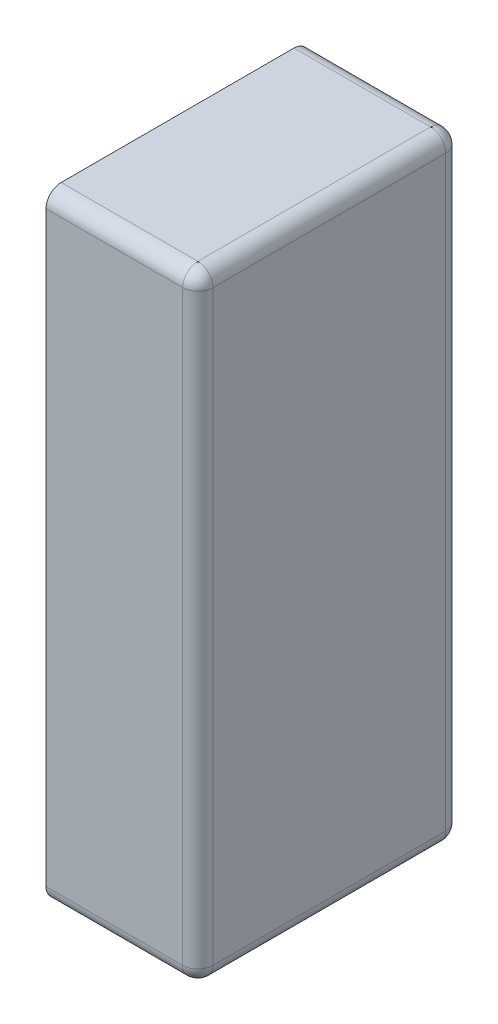
ISO-10303-21;
HEADER;
FILE_DESCRIPTION(('STEP AP214'),'2;1');
FILE_NAME('part.step','',(''),(''),'','','');
FILE_SCHEMA(('AUTOMOTIVE_DESIGN { 1 0 10303 214 1 1 1 1 }'));
ENDSEC;
DATA;
#1=APPLICATION_CONTEXT('core data for automotive mechanical design processes');
#2=APPLICATION_PROTOCOL_DEFINITION('international standard','automotive_design',2000,#1);
#3=PRODUCT_CONTEXT('',#1,'mechanical');
#4=PRODUCT('Part','Part','',(#3));
#5=PRODUCT_RELATED_PRODUCT_CATEGORY('part','',(#4));
#6=PRODUCT_DEFINITION_FORMATION('','',#4);
#7=PRODUCT_DEFINITION_CONTEXT('part definition',#1,'design');
#8=PRODUCT_DEFINITION('design','',#6,#7);
#9=PRODUCT_DEFINITION_SHAPE('','',#8);
#10=(LENGTH_UNIT() NAMED_UNIT(*) SI_UNIT(.MILLI.,.METRE.));
#11=(NAMED_UNIT(*) PLANE_ANGLE_UNIT() SI_UNIT($,.RADIAN.));
#12=(NAMED_UNIT(*) SI_UNIT($,.STERADIAN.) SOLID_ANGLE_UNIT());
#13=UNCERTAINTY_MEASURE_WITH_UNIT(LENGTH_MEASURE(1.E-05),#10,'distance_accuracy_value','');
#14=(GEOMETRIC_REPRESENTATION_CONTEXT(3) GLOBAL_UNCERTAINTY_ASSIGNED_CONTEXT((#13)) GLOBAL_UNIT_ASSIGNED_CONTEXT((#10,
#11,#12)) REPRESENTATION_CONTEXT('',''));
#15=CARTESIAN_POINT('',(0.,0.,0.));
#16=DIRECTION('',(0.,0.,1.));
#17=DIRECTION('',(1.,0.,0.));
#18=AXIS2_PLACEMENT_3D('',#15,#16,#17);
#19=CARTESIAN_POINT('',(1.,0.58,0.02));
#20=DIRECTION('',(-1.,0.,0.));
#21=DIRECTION('',(0.,-1.,0.));
#22=AXIS2_PLACEMENT_3D('',#19,#20,#21);
#23=CYLINDRICAL_SURFACE('',#22,0.03);
#24=DIRECTION('',(1.,0.,0.));
#25=VECTOR('',#24,1.);
#26=CARTESIAN_POINT('',(0.7,0.61,0.02));
#27=LINE('',#26,#25);
#28=CARTESIAN_POINT('',(0.7,0.61,0.02));
#29=VERTEX_POINT('',#28);
#30=CARTESIAN_POINT('',(0.97,0.61,0.02));
#31=VERTEX_POINT('',#30);
#32=EDGE_CURVE('E177',#29,#31,#27,.T.);
#33=ORIENTED_EDGE('',*,*,#32,.T.);
#34=CARTESIAN_POINT('',(0.97,0.58,0.02));
#35=DIRECTION('',(1.,0.,0.));
#36=DIRECTION('',(0.,0.,-1.));
#37=AXIS2_PLACEMENT_3D('',#34,#35,#36);
#38=CIRCLE('',#37,0.03);
#39=CARTESIAN_POINT('',(0.97,0.58,-0.01));
#40=VERTEX_POINT('',#39);
#41=EDGE_CURVE('E120',#40,#31,#38,.T.);
#42=ORIENTED_EDGE('',*,*,#41,.F.);
#43=DIRECTION('',(-1.,0.,0.));
#44=VECTOR('',#43,1.);
#45=CARTESIAN_POINT('',(0.97,0.58,-0.01));
#46=LINE('',#45,#44);
#47=CARTESIAN_POINT('',(0.7,0.58,-0.01));
#48=VERTEX_POINT('',#47);
#49=EDGE_CURVE('E11',#40,#48,#46,.T.);
#50=ORIENTED_EDGE('',*,*,#49,.T.);
#51=CARTESIAN_POINT('',(0.7,0.58,0.02));
#52=DIRECTION('',(-1.,0.,0.));
#53=DIRECTION('',(0.,1.,0.));
#54=AXIS2_PLACEMENT_3D('',#51,#52,#53);
#55=CIRCLE('',#54,0.03);
#56=EDGE_CURVE('E118',#29,#48,#55,.T.);
#57=ORIENTED_EDGE('',*,*,#56,.F.);
#58=EDGE_LOOP('',(#33,#42,#50,#57));
#59=FACE_BOUND('',#58,.T.);
#60=ADVANCED_FACE('F17',(#59),#23,.T.);
#61=CARTESIAN_POINT('',(1.,-0.61,-0.01));
#62=DIRECTION('',(0.,0.,1.));
#63=DIRECTION('',(1.,0.,0.));
#64=AXIS2_PLACEMENT_3D('',#61,#62,#63);
#65=PLANE('',#64);
#66=DIRECTION('',(0.,-1.,0.));
#67=VECTOR('',#66,1.);
#68=CARTESIAN_POINT('',(0.7,0.58,-0.01));
#69=LINE('',#68,#67);
#70=CARTESIAN_POINT('',(0.7,-0.58,-0.01));
#71=VERTEX_POINT('',#70);
#72=EDGE_CURVE('E122',#48,#71,#69,.T.);
#73=ORIENTED_EDGE('',*,*,#72,.F.);
#74=ORIENTED_EDGE('',*,*,#49,.F.);
#75=DIRECTION('',(0.,1.,0.));
#76=VECTOR('',#75,1.);
#77=CARTESIAN_POINT('',(0.97,-0.58,-0.01));
#78=LINE('',#77,#76);
#79=CARTESIAN_POINT('',(0.97,-0.58,-0.01));
#80=VERTEX_POINT('',#79);
#81=EDGE_CURVE('E198',#80,#40,#78,.T.);
#82=ORIENTED_EDGE('',*,*,#81,.F.);
#83=DIRECTION('',(1.,0.,0.));
#84=VECTOR('',#83,1.);
#85=CARTESIAN_POINT('',(0.7,-0.58,-0.01));
#86=LINE('',#85,#84);
#87=EDGE_CURVE('E25',#71,#80,#86,.T.);
#88=ORIENTED_EDGE('',*,*,#87,.F.);
#89=EDGE_LOOP('',(#73,#74,#82,#88));
#90=FACE_BOUND('',#89,.T.);
#91=ADVANCED_FACE('F123',(#90),#65,.F.);
#92=CARTESIAN_POINT('',(1.,-0.58,0.02));
#93=DIRECTION('',(-1.,0.,0.));
#94=DIRECTION('',(0.,-1.,0.));
#95=AXIS2_PLACEMENT_3D('',#92,#93,#94);
#96=CYLINDRICAL_SURFACE('',#95,0.03);
#97=ORIENTED_EDGE('',*,*,#87,.T.);
#98=CARTESIAN_POINT('',(0.97,-0.58,0.02));
#99=DIRECTION('',(1.,0.,0.));
#100=DIRECTION('',(0.,-1.,0.));
#101=AXIS2_PLACEMENT_3D('',#98,#99,#100);
#102=CIRCLE('',#101,0.03);
#103=CARTESIAN_POINT('',(0.97,-0.61,0.02));
#104=VERTEX_POINT('',#103);
#105=EDGE_CURVE('E209',#104,#80,#102,.T.);
#106=ORIENTED_EDGE('',*,*,#105,.F.);
#107=DIRECTION('',(-1.,0.,0.));
#108=VECTOR('',#107,1.);
#109=CARTESIAN_POINT('',(0.97,-0.61,0.02));
#110=LINE('',#109,#108);
#111=CARTESIAN_POINT('',(0.7,-0.61,0.02));
#112=VERTEX_POINT('',#111);
#113=EDGE_CURVE('E50',#104,#112,#110,.T.);
#114=ORIENTED_EDGE('',*,*,#113,.T.);
#115=CARTESIAN_POINT('',(0.7,-0.58,0.02));
#116=DIRECTION('',(-1.,0.,0.));
#117=DIRECTION('',(0.,0.,-1.));
#118=AXIS2_PLACEMENT_3D('',#115,#116,#117);
#119=CIRCLE('',#118,0.03);
#120=EDGE_CURVE('E127',#71,#112,#119,.T.);
#121=ORIENTED_EDGE('',*,*,#120,.F.);
#122=EDGE_LOOP('',(#97,#106,#114,#121));
#123=FACE_BOUND('',#122,.T.);
#124=ADVANCED_FACE('F234',(#123),#96,.T.);
#125=CARTESIAN_POINT('',(1.,-0.61,0.51));
#126=DIRECTION('',(0.,1.,0.));
#127=DIRECTION('',(1.,0.,0.));
#128=AXIS2_PLACEMENT_3D('',#125,#126,#127);
#129=PLANE('',#128);
#130=DIRECTION('',(0.,0.,1.));
#131=VECTOR('',#130,1.);
#132=CARTESIAN_POINT('',(0.7,-0.61,0.02));
#133=LINE('',#132,#131);
#134=CARTESIAN_POINT('',(0.7,-0.61,0.48));
#135=VERTEX_POINT('',#134);
#136=EDGE_CURVE('E150',#112,#135,#133,.T.);
#137=ORIENTED_EDGE('',*,*,#136,.F.);
#138=ORIENTED_EDGE('',*,*,#113,.F.);
#139=DIRECTION('',(0.,0.,-1.));
#140=VECTOR('',#139,1.);
#141=CARTESIAN_POINT('',(0.97,-0.61,0.48));
#142=LINE('',#141,#140);
#143=CARTESIAN_POINT('',(0.97,-0.61,0.48));
#144=VERTEX_POINT('',#143);
#145=EDGE_CURVE('E216',#144,#104,#142,.T.);
#146=ORIENTED_EDGE('',*,*,#145,.F.);
#147=DIRECTION('',(1.,0.,0.));
#148=VECTOR('',#147,1.);
#149=CARTESIAN_POINT('',(0.7,-0.61,0.48));
#150=LINE('',#149,#148);
#151=EDGE_CURVE('E147',#135,#144,#150,.T.);
#152=ORIENTED_EDGE('',*,*,#151,.F.);
#153=EDGE_LOOP('',(#137,#138,#146,#152));
#154=FACE_BOUND('',#153,.T.);
#155=ADVANCED_FACE('F236',(#154),#129,.F.);
#156=CARTESIAN_POINT('',(0.97,0.58,0.48));
#157=DIRECTION('',(0.,1.,0.));
#158=DIRECTION('',(1.,0.,0.));
#159=AXIS2_PLACEMENT_3D('',#156,#157,#158);
#160=SPHERICAL_SURFACE('',#159,0.03);
#161=CARTESIAN_POINT('',(0.97,0.58,0.48));
#162=DIRECTION('',(0.,1.,0.));
#163=DIRECTION('',(0.,0.,1.));
#164=AXIS2_PLACEMENT_3D('',#161,#162,#163);
#165=CIRCLE('',#164,0.03);
#166=CARTESIAN_POINT('',(0.97,0.58,0.51));
#167=VERTEX_POINT('',#166);
#168=CARTESIAN_POINT('',(1.,0.58,0.48));
#169=VERTEX_POINT('',#168);
#170=EDGE_CURVE('E224',#167,#169,#165,.T.);
#171=ORIENTED_EDGE('',*,*,#170,.T.);
#172=CARTESIAN_POINT('',(0.97,0.58,0.48));
#173=DIRECTION('',(0.,0.,1.));
#174=DIRECTION('',(1.,0.,0.));
#175=AXIS2_PLACEMENT_3D('',#172,#173,#174);
#176=CIRCLE('',#175,0.03);
#177=CARTESIAN_POINT('',(0.97,0.61,0.48));
#178=VERTEX_POINT('',#177);
#179=EDGE_CURVE('E166',#169,#178,#176,.T.);
#180=ORIENTED_EDGE('',*,*,#179,.T.);
#181=CARTESIAN_POINT('',(0.97,0.58,0.48));
#182=DIRECTION('',(1.,0.,0.));
#183=DIRECTION('',(0.,1.,0.));
#184=AXIS2_PLACEMENT_3D('',#181,#182,#183);
#185=CIRCLE('',#184,0.03);
#186=EDGE_CURVE('E37',#178,#167,#185,.T.);
#187=ORIENTED_EDGE('',*,*,#186,.T.);
#188=EDGE_LOOP('',(#171,#180,#187));
#189=FACE_BOUND('',#188,.T.);
#190=ADVANCED_FACE('F476',(#189),#160,.T.);
#191=CARTESIAN_POINT('',(1.,0.58,0.48));
#192=DIRECTION('',(-1.,0.,0.));
#193=DIRECTION('',(0.,-1.,0.));
#194=AXIS2_PLACEMENT_3D('',#191,#192,#193);
#195=CYLINDRICAL_SURFACE('',#194,0.03);
#196=DIRECTION('',(1.,0.,0.));
#197=VECTOR('',#196,1.);
#198=CARTESIAN_POINT('',(0.7,0.58,0.51));
#199=LINE('',#198,#197);
#200=CARTESIAN_POINT('',(0.7,0.58,0.51));
#201=VERTEX_POINT('',#200);
#202=EDGE_CURVE('E158',#201,#167,#199,.T.);
#203=ORIENTED_EDGE('',*,*,#202,.T.);
#204=ORIENTED_EDGE('',*,*,#186,.F.);
#205=DIRECTION('',(-1.,0.,0.));
#206=VECTOR('',#205,1.);
#207=CARTESIAN_POINT('',(0.97,0.61,0.48));
#208=LINE('',#207,#206);
#209=CARTESIAN_POINT('',(0.7,0.61,0.48));
#210=VERTEX_POINT('',#209);
#211=EDGE_CURVE('E170',#178,#210,#208,.T.);
#212=ORIENTED_EDGE('',*,*,#211,.T.);
#213=CARTESIAN_POINT('',(0.7,0.58,0.48));
#214=DIRECTION('',(-1.,0.,0.));
#215=DIRECTION('',(0.,0.,1.));
#216=AXIS2_PLACEMENT_3D('',#213,#214,#215);
#217=CIRCLE('',#216,0.03);
#218=EDGE_CURVE('E165',#201,#210,#217,.T.);
#219=ORIENTED_EDGE('',*,*,#218,.F.);
#220=EDGE_LOOP('',(#203,#204,#212,#219));
#221=FACE_BOUND('',#220,.T.);
#222=ADVANCED_FACE('F485',(#221),#195,.T.);
#223=CARTESIAN_POINT('',(1.,0.61,0.51));
#224=DIRECTION('',(0.,0.,-1.));
#225=DIRECTION('',(0.,-1.,0.));
#226=AXIS2_PLACEMENT_3D('',#223,#224,#225);
#227=PLANE('',#226);
#228=DIRECTION('',(0.,-1.,0.));
#229=VECTOR('',#228,1.);
#230=CARTESIAN_POINT('',(0.97,0.58,0.51));
#231=LINE('',#230,#229);
#232=CARTESIAN_POINT('',(0.97,-0.58,0.51));
#233=VERTEX_POINT('',#232);
#234=EDGE_CURVE('E161',#167,#233,#231,.T.);
#235=ORIENTED_EDGE('',*,*,#234,.F.);
#236=ORIENTED_EDGE('',*,*,#202,.F.);
#237=DIRECTION('',(0.,1.,0.));
#238=VECTOR('',#237,1.);
#239=CARTESIAN_POINT('',(0.7,-0.58,0.51));
#240=LINE('',#239,#238);
#241=CARTESIAN_POINT('',(0.7,-0.58,0.51));
#242=VERTEX_POINT('',#241);
#243=EDGE_CURVE('E157',#242,#201,#240,.T.);
#244=ORIENTED_EDGE('',*,*,#243,.F.);
#245=DIRECTION('',(-1.,0.,0.));
#246=VECTOR('',#245,1.);
#247=CARTESIAN_POINT('',(0.97,-0.58,0.51));
#248=LINE('',#247,#246);
#249=EDGE_CURVE('E143',#233,#242,#248,.T.);
#250=ORIENTED_EDGE('',*,*,#249,.F.);
#251=EDGE_LOOP('',(#235,#236,#244,#250));
#252=FACE_BOUND('',#251,.T.);
#253=ADVANCED_FACE('F250',(#252),#227,.F.);
#254=CARTESIAN_POINT('',(0.97,0.,0.48));
#255=DIRECTION('',(0.,1.,0.));
#256=DIRECTION('',(-1.,0.,0.));
#257=AXIS2_PLACEMENT_3D('',#254,#255,#256);
#258=CYLINDRICAL_SURFACE('',#257,0.03);
#259=DIRECTION('',(0.,1.,0.));
#260=VECTOR('',#259,1.);
#261=CARTESIAN_POINT('',(1.,-0.58,0.48));
#262=LINE('',#261,#260);
#263=CARTESIAN_POINT('',(1.,-0.58,0.48));
#264=VERTEX_POINT('',#263);
#265=EDGE_CURVE('E223',#264,#169,#262,.T.);
#266=ORIENTED_EDGE('',*,*,#265,.T.);
#267=ORIENTED_EDGE('',*,*,#170,.F.);
#268=ORIENTED_EDGE('',*,*,#234,.T.);
#269=CARTESIAN_POINT('',(0.97,-0.58,0.48));
#270=DIRECTION('',(0.,-1.,0.));
#271=DIRECTION('',(1.,0.,0.));
#272=AXIS2_PLACEMENT_3D('',#269,#270,#271);
#273=CIRCLE('',#272,0.03);
#274=EDGE_CURVE('E281',#264,#233,#273,.T.);
#275=ORIENTED_EDGE('',*,*,#274,.F.);
#276=EDGE_LOOP('',(#266,#267,#268,#275));
#277=FACE_BOUND('',#276,.T.);
#278=ADVANCED_FACE('F282',(#277),#258,.T.);
#279=CARTESIAN_POINT('',(1.,0.,0.));
#280=DIRECTION('',(1.,0.,0.));
#281=DIRECTION('',(0.,1.,0.));
#282=AXIS2_PLACEMENT_3D('',#279,#280,#281);
#283=PLANE('',#282);
#284=DIRECTION('',(0.,-1.,0.));
#285=VECTOR('',#284,1.);
#286=CARTESIAN_POINT('',(1.,0.58,0.02));
#287=LINE('',#286,#285);
#288=CARTESIAN_POINT('',(1.,0.58,0.02));
#289=VERTEX_POINT('',#288);
#290=CARTESIAN_POINT('',(1.,-0.58,0.02));
#291=VERTEX_POINT('',#290);
#292=EDGE_CURVE('E201',#289,#291,#287,.T.);
#293=ORIENTED_EDGE('',*,*,#292,.F.);
#294=DIRECTION('',(0.,0.,-1.));
#295=VECTOR('',#294,1.);
#296=CARTESIAN_POINT('',(1.,0.58,0.48));
#297=LINE('',#296,#295);
#298=EDGE_CURVE('E169',#169,#289,#297,.T.);
#299=ORIENTED_EDGE('',*,*,#298,.F.);
#300=ORIENTED_EDGE('',*,*,#265,.F.);
#301=DIRECTION('',(0.,0.,1.));
#302=VECTOR('',#301,1.);
#303=CARTESIAN_POINT('',(1.,-0.58,0.02));
#304=LINE('',#303,#302);
#305=EDGE_CURVE('E219',#291,#264,#304,.T.);
#306=ORIENTED_EDGE('',*,*,#305,.F.);
#307=EDGE_LOOP('',(#293,#299,#300,#306));
#308=FACE_BOUND('',#307,.T.);
#309=ADVANCED_FACE('F278',(#308),#283,.T.);
#310=CARTESIAN_POINT('',(0.97,-0.58,0.));
#311=DIRECTION('',(0.,0.,1.));
#312=DIRECTION('',(1.,0.,0.));
#313=AXIS2_PLACEMENT_3D('',#310,#311,#312);
#314=CYLINDRICAL_SURFACE('',#313,0.03);
#315=ORIENTED_EDGE('',*,*,#145,.T.);
#316=CARTESIAN_POINT('',(0.97,-0.58,0.02));
#317=DIRECTION('',(0.,0.,-1.));
#318=DIRECTION('',(1.,0.,0.));
#319=AXIS2_PLACEMENT_3D('',#316,#317,#318);
#320=CIRCLE('',#319,0.03);
#321=EDGE_CURVE('E212',#291,#104,#320,.T.);
#322=ORIENTED_EDGE('',*,*,#321,.F.);
#323=ORIENTED_EDGE('',*,*,#305,.T.);
#324=CARTESIAN_POINT('',(0.97,-0.58,0.48));
#325=DIRECTION('',(0.,0.,1.));
#326=DIRECTION('',(0.,-1.,0.));
#327=AXIS2_PLACEMENT_3D('',#324,#325,#326);
#328=CIRCLE('',#327,0.03);
#329=EDGE_CURVE('E269',#144,#264,#328,.T.);
#330=ORIENTED_EDGE('',*,*,#329,.F.);
#331=EDGE_LOOP('',(#315,#322,#323,#330));
#332=FACE_BOUND('',#331,.T.);
#333=ADVANCED_FACE('F267',(#332),#314,.T.);
#334=CARTESIAN_POINT('',(0.97,-0.58,0.02));
#335=DIRECTION('',(0.,1.,0.));
#336=DIRECTION('',(1.,0.,0.));
#337=AXIS2_PLACEMENT_3D('',#334,#335,#336);
#338=SPHERICAL_SURFACE('',#337,0.03);
#339=ORIENTED_EDGE('',*,*,#105,.T.);
#340=CARTESIAN_POINT('',(0.97,-0.58,0.02));
#341=DIRECTION('',(0.,-1.,0.));
#342=DIRECTION('',(0.,0.,-1.));
#343=AXIS2_PLACEMENT_3D('',#340,#341,#342);
#344=CIRCLE('',#343,0.03);
#345=EDGE_CURVE('E205',#80,#291,#344,.T.);
#346=ORIENTED_EDGE('',*,*,#345,.T.);
#347=ORIENTED_EDGE('',*,*,#321,.T.);
#348=EDGE_LOOP('',(#339,#346,#347));
#349=FACE_BOUND('',#348,.T.);
#350=ADVANCED_FACE('F271',(#349),#338,.T.);
#351=CARTESIAN_POINT('',(0.97,0.,0.02));
#352=DIRECTION('',(0.,-1.,0.));
#353=DIRECTION('',(1.,0.,0.));
#354=AXIS2_PLACEMENT_3D('',#351,#352,#353);
#355=CYLINDRICAL_SURFACE('',#354,0.03);
#356=ORIENTED_EDGE('',*,*,#81,.T.);
#357=CARTESIAN_POINT('',(0.97,0.58,0.02));
#358=DIRECTION('',(0.,1.,0.));
#359=DIRECTION('',(1.,0.,0.));
#360=AXIS2_PLACEMENT_3D('',#357,#358,#359);
#361=CIRCLE('',#360,0.03);
#362=EDGE_CURVE('E192',#289,#40,#361,.T.);
#363=ORIENTED_EDGE('',*,*,#362,.F.);
#364=ORIENTED_EDGE('',*,*,#292,.T.);
#365=ORIENTED_EDGE('',*,*,#345,.F.);
#366=EDGE_LOOP('',(#356,#363,#364,#365));
#367=FACE_BOUND('',#366,.T.);
#368=ADVANCED_FACE('F275',(#367),#355,.T.);
#369=CARTESIAN_POINT('',(0.97,0.58,0.02));
#370=DIRECTION('',(0.,1.,0.));
#371=DIRECTION('',(1.,0.,0.));
#372=AXIS2_PLACEMENT_3D('',#369,#370,#371);
#373=SPHERICAL_SURFACE('',#372,0.03);
#374=ORIENTED_EDGE('',*,*,#41,.T.);
#375=CARTESIAN_POINT('',(0.97,0.58,0.02));
#376=DIRECTION('',(0.,0.,-1.));
#377=DIRECTION('',(0.,1.,0.));
#378=AXIS2_PLACEMENT_3D('',#375,#376,#377);
#379=CIRCLE('',#378,0.03);
#380=EDGE_CURVE('E186',#31,#289,#379,.T.);
#381=ORIENTED_EDGE('',*,*,#380,.T.);
#382=ORIENTED_EDGE('',*,*,#362,.T.);
#383=EDGE_LOOP('',(#374,#381,#382));
#384=FACE_BOUND('',#383,.T.);
#385=ADVANCED_FACE('F466',(#384),#373,.T.);
#386=CARTESIAN_POINT('',(0.97,0.58,0.));
#387=DIRECTION('',(0.,0.,-1.));
#388=DIRECTION('',(-1.,0.,0.));
#389=AXIS2_PLACEMENT_3D('',#386,#387,#388);
#390=CYLINDRICAL_SURFACE('',#389,0.03);
#391=DIRECTION('',(0.,0.,1.));
#392=VECTOR('',#391,1.);
#393=CARTESIAN_POINT('',(0.97,0.61,0.02));
#394=LINE('',#393,#392);
#395=EDGE_CURVE('E173',#31,#178,#394,.T.);
#396=ORIENTED_EDGE('',*,*,#395,.T.);
#397=ORIENTED_EDGE('',*,*,#179,.F.);
#398=ORIENTED_EDGE('',*,*,#298,.T.);
#399=ORIENTED_EDGE('',*,*,#380,.F.);
#400=EDGE_LOOP('',(#396,#397,#398,#399));
#401=FACE_BOUND('',#400,.T.);
#402=ADVANCED_FACE('F440',(#401),#390,.T.);
#403=CARTESIAN_POINT('',(1.,0.61,-0.01));
#404=DIRECTION('',(0.,-1.,0.));
#405=DIRECTION('',(0.,0.,-1.));
#406=AXIS2_PLACEMENT_3D('',#403,#404,#405);
#407=PLANE('',#406);
#408=ORIENTED_EDGE('',*,*,#395,.F.);
#409=ORIENTED_EDGE('',*,*,#32,.F.);
#410=DIRECTION('',(0.,0.,-1.));
#411=VECTOR('',#410,1.);
#412=CARTESIAN_POINT('',(0.7,0.61,0.48));
#413=LINE('',#412,#411);
#414=EDGE_CURVE('E132',#210,#29,#413,.T.);
#415=ORIENTED_EDGE('',*,*,#414,.F.);
#416=ORIENTED_EDGE('',*,*,#211,.F.);
#417=EDGE_LOOP('',(#408,#409,#415,#416));
#418=FACE_BOUND('',#417,.T.);
#419=ADVANCED_FACE('F406',(#418),#407,.F.);
#420=CARTESIAN_POINT('',(0.7,0.,0.));
#421=DIRECTION('',(1.,0.,0.));
#422=DIRECTION('',(0.,1.,0.));
#423=AXIS2_PLACEMENT_3D('',#420,#421,#422);
#424=PLANE('',#423);
#425=ORIENTED_EDGE('',*,*,#414,.T.);
#426=ORIENTED_EDGE('',*,*,#56,.T.);
#427=ORIENTED_EDGE('',*,*,#72,.T.);
#428=ORIENTED_EDGE('',*,*,#120,.T.);
#429=ORIENTED_EDGE('',*,*,#136,.T.);
#430=CARTESIAN_POINT('',(0.7,-0.58,0.48));
#431=DIRECTION('',(-1.,0.,0.));
#432=DIRECTION('',(0.,-1.,0.));
#433=AXIS2_PLACEMENT_3D('',#430,#431,#432);
#434=CIRCLE('',#433,0.03);
#435=EDGE_CURVE('E139',#135,#242,#434,.T.);
#436=ORIENTED_EDGE('',*,*,#435,.T.);
#437=ORIENTED_EDGE('',*,*,#243,.T.);
#438=ORIENTED_EDGE('',*,*,#218,.T.);
#439=EDGE_LOOP('',(#425,#426,#427,#428,#429,#436,#437,#438));
#440=FACE_BOUND('',#439,.T.);
#441=ADVANCED_FACE('F129',(#440),#424,.F.);
#442=CARTESIAN_POINT('',(1.,-0.58,0.48));
#443=DIRECTION('',(-1.,0.,0.));
#444=DIRECTION('',(0.,-1.,0.));
#445=AXIS2_PLACEMENT_3D('',#442,#443,#444);
#446=CYLINDRICAL_SURFACE('',#445,0.03);
#447=ORIENTED_EDGE('',*,*,#151,.T.);
#448=CARTESIAN_POINT('',(0.97,-0.58,0.48));
#449=DIRECTION('',(1.,0.,0.));
#450=DIRECTION('',(0.,0.,1.));
#451=AXIS2_PLACEMENT_3D('',#448,#449,#450);
#452=CIRCLE('',#451,0.03);
#453=EDGE_CURVE('E246',#233,#144,#452,.T.);
#454=ORIENTED_EDGE('',*,*,#453,.F.);
#455=ORIENTED_EDGE('',*,*,#249,.T.);
#456=ORIENTED_EDGE('',*,*,#435,.F.);
#457=EDGE_LOOP('',(#447,#454,#455,#456));
#458=FACE_BOUND('',#457,.T.);
#459=ADVANCED_FACE('F241',(#458),#446,.T.);
#460=CARTESIAN_POINT('',(0.97,-0.58,0.48));
#461=DIRECTION('',(0.,1.,0.));
#462=DIRECTION('',(1.,0.,0.));
#463=AXIS2_PLACEMENT_3D('',#460,#461,#462);
#464=SPHERICAL_SURFACE('',#463,0.03);
#465=ORIENTED_EDGE('',*,*,#329,.T.);
#466=ORIENTED_EDGE('',*,*,#274,.T.);
#467=ORIENTED_EDGE('',*,*,#453,.T.);
#468=EDGE_LOOP('',(#465,#466,#467));
#469=FACE_BOUND('',#468,.T.);
#470=ADVANCED_FACE('F286',(#469),#464,.T.);
#471=CLOSED_SHELL('',(#60,#91,#124,#155,#190,#222,#253,#278,#309,#333,#350,#368,#385,#402,#419,
#441,#459,#470));
#472=MANIFOLD_SOLID_BREP('B1',#471);
#473=ADVANCED_BREP_SHAPE_REPRESENTATION('',(#18,#472),#14);
#474=SHAPE_DEFINITION_REPRESENTATION(#9,#473);
ENDSEC;
END-ISO-10303-21;
